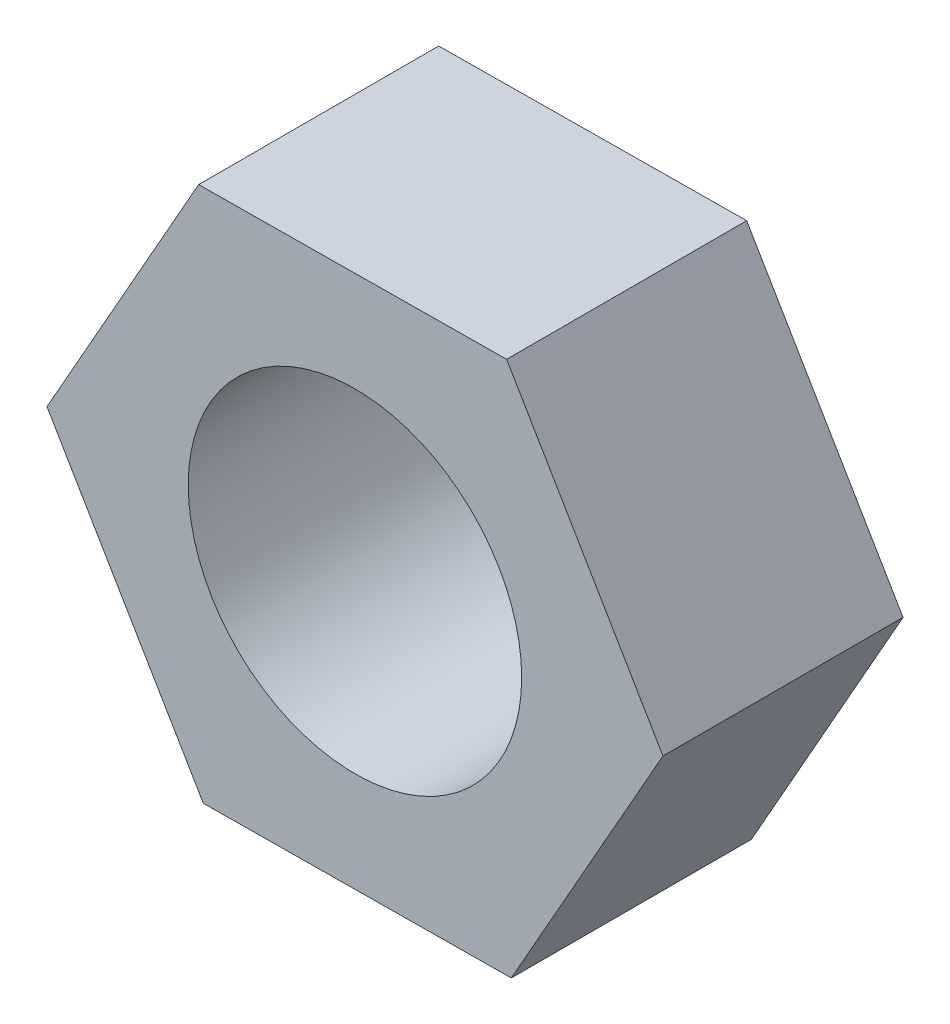
ISO-10303-21;
HEADER;
FILE_DESCRIPTION(('STEP AP214'),'2;1');
FILE_NAME('part.step','',(''),(''),'','','');
FILE_SCHEMA(('AUTOMOTIVE_DESIGN { 1 0 10303 214 1 1 1 1 }'));
ENDSEC;
DATA;
#1=APPLICATION_CONTEXT('core data for automotive mechanical design processes');
#2=APPLICATION_PROTOCOL_DEFINITION('international standard','automotive_design',2000,#1);
#3=PRODUCT_CONTEXT('',#1,'mechanical');
#4=PRODUCT('Part','Part','',(#3));
#5=PRODUCT_RELATED_PRODUCT_CATEGORY('part','',(#4));
#6=PRODUCT_DEFINITION_FORMATION('','',#4);
#7=PRODUCT_DEFINITION_CONTEXT('part definition',#1,'design');
#8=PRODUCT_DEFINITION('design','',#6,#7);
#9=PRODUCT_DEFINITION_SHAPE('','',#8);
#10=(LENGTH_UNIT() NAMED_UNIT(*) SI_UNIT(.MILLI.,.METRE.));
#11=(NAMED_UNIT(*) PLANE_ANGLE_UNIT() SI_UNIT($,.RADIAN.));
#12=(NAMED_UNIT(*) SI_UNIT($,.STERADIAN.) SOLID_ANGLE_UNIT());
#13=UNCERTAINTY_MEASURE_WITH_UNIT(LENGTH_MEASURE(1.E-05),#10,'distance_accuracy_value','');
#14=(GEOMETRIC_REPRESENTATION_CONTEXT(3) GLOBAL_UNCERTAINTY_ASSIGNED_CONTEXT((#13)) GLOBAL_UNIT_ASSIGNED_CONTEXT((#10,
#11,#12)) REPRESENTATION_CONTEXT('',''));
#15=CARTESIAN_POINT('',(0.,0.,0.));
#16=DIRECTION('',(0.,0.,1.));
#17=DIRECTION('',(1.,0.,0.));
#18=AXIS2_PLACEMENT_3D('',#15,#16,#17);
#19=CARTESIAN_POINT('',(0.,0.,3.6));
#20=DIRECTION('',(0.,0.,1.));
#21=DIRECTION('',(1.,0.,0.));
#22=AXIS2_PLACEMENT_3D('',#19,#20,#21);
#23=PLANE('',#22);
#24=DIRECTION('',(0.999961257640527,0.00880245522430782,0.));
#25=VECTOR('',#24,1.);
#26=CARTESIAN_POINT('',(-2.27410178421459,-4.02017343013524,3.6));
#27=LINE('',#26,#25);
#28=CARTESIAN_POINT('',(-2.27410178421459,-4.02017343013524,3.6));
#29=VERTEX_POINT('',#28);
#30=CARTESIAN_POINT('',(2.34452142600905,-3.97951663098897,3.6));
#31=VERTEX_POINT('',#30);
#32=EDGE_CURVE('E146',#29,#31,#27,.T.);
#33=ORIENTED_EDGE('',*,*,#32,.T.);
#34=DIRECTION('',(0.492357478980338,0.870393079529086,0.));
#35=VECTOR('',#34,1.);
#36=CARTESIAN_POINT('',(2.34452142600905,-3.97951663098897,3.6));
#37=LINE('',#36,#35);
#38=CARTESIAN_POINT('',(4.61862321022364,0.0406567991462702,3.6));
#39=VERTEX_POINT('',#38);
#40=EDGE_CURVE('E94',#31,#39,#37,.T.);
#41=ORIENTED_EDGE('',*,*,#40,.T.);
#42=DIRECTION('',(-0.507603778660189,0.861590624304778,0.));
#43=VECTOR('',#42,1.);
#44=CARTESIAN_POINT('',(4.61862321022364,0.0406567991462702,3.6));
#45=LINE('',#44,#43);
#46=CARTESIAN_POINT('',(2.27410178421459,4.02017343013524,3.6));
#47=VERTEX_POINT('',#46);
#48=EDGE_CURVE('E107',#39,#47,#45,.T.);
#49=ORIENTED_EDGE('',*,*,#48,.T.);
#50=DIRECTION('',(-0.999961257640527,-0.00880245522430783,0.));
#51=VECTOR('',#50,1.);
#52=CARTESIAN_POINT('',(2.27410178421459,4.02017343013524,3.6));
#53=LINE('',#52,#51);
#54=CARTESIAN_POINT('',(-2.34452142600905,3.97951663098897,3.6));
#55=VERTEX_POINT('',#54);
#56=EDGE_CURVE('E101',#47,#55,#53,.T.);
#57=ORIENTED_EDGE('',*,*,#56,.T.);
#58=DIRECTION('',(-0.492357478980338,-0.870393079529086,0.));
#59=VECTOR('',#58,1.);
#60=CARTESIAN_POINT('',(-2.34452142600905,3.97951663098897,3.6));
#61=LINE('',#60,#59);
#62=CARTESIAN_POINT('',(-4.61862321022364,-0.0406567991462695,3.6));
#63=VERTEX_POINT('',#62);
#64=EDGE_CURVE('E105',#55,#63,#61,.T.);
#65=ORIENTED_EDGE('',*,*,#64,.T.);
#66=DIRECTION('',(0.507603778660189,-0.861590624304779,0.));
#67=VECTOR('',#66,1.);
#68=CARTESIAN_POINT('',(-4.61862321022364,-0.0406567991462695,3.6));
#69=LINE('',#68,#67);
#70=EDGE_CURVE('E57',#63,#29,#69,.T.);
#71=ORIENTED_EDGE('',*,*,#70,.T.);
#72=EDGE_LOOP('',(#33,#41,#49,#57,#65,#71));
#73=FACE_BOUND('',#72,.T.);
#74=CARTESIAN_POINT('',(0.,0.,3.6));
#75=DIRECTION('',(0.,0.,1.));
#76=DIRECTION('',(1.,0.,0.));
#77=AXIS2_PLACEMENT_3D('',#74,#75,#76);
#78=CIRCLE('',#77,2.5);
#79=CARTESIAN_POINT('',(2.5,0.,3.6));
#80=VERTEX_POINT('',#79);
#81=EDGE_CURVE('E134',#80,#80,#78,.T.);
#82=ORIENTED_EDGE('',*,*,#81,.F.);
#83=EDGE_LOOP('',(#82));
#84=FACE_BOUND('',#83,.T.);
#85=ADVANCED_FACE('F39',(#73,#84),#23,.T.);
#86=CARTESIAN_POINT('',(0.,0.,0.));
#87=DIRECTION('',(0.,0.,1.));
#88=DIRECTION('',(1.,0.,0.));
#89=AXIS2_PLACEMENT_3D('',#86,#87,#88);
#90=PLANE('',#89);
#91=DIRECTION('',(0.999961257640527,0.00880245522430782,0.));
#92=VECTOR('',#91,1.);
#93=CARTESIAN_POINT('',(-2.27410178421459,-4.02017343013524,0.));
#94=LINE('',#93,#92);
#95=CARTESIAN_POINT('',(-2.27410178421459,-4.02017343013524,0.));
#96=VERTEX_POINT('',#95);
#97=CARTESIAN_POINT('',(2.34452142600905,-3.97951663098897,0.));
#98=VERTEX_POINT('',#97);
#99=EDGE_CURVE('E129',#96,#98,#94,.T.);
#100=ORIENTED_EDGE('',*,*,#99,.F.);
#101=DIRECTION('',(0.507603778660189,-0.861590624304779,0.));
#102=VECTOR('',#101,1.);
#103=CARTESIAN_POINT('',(-4.61862321022364,-0.0406567991462695,0.));
#104=LINE('',#103,#102);
#105=CARTESIAN_POINT('',(-4.61862321022364,-0.0406567991462695,0.));
#106=VERTEX_POINT('',#105);
#107=EDGE_CURVE('E86',#106,#96,#104,.T.);
#108=ORIENTED_EDGE('',*,*,#107,.F.);
#109=DIRECTION('',(-0.492357478980338,-0.870393079529086,0.));
#110=VECTOR('',#109,1.);
#111=CARTESIAN_POINT('',(-2.34452142600905,3.97951663098897,0.));
#112=LINE('',#111,#110);
#113=CARTESIAN_POINT('',(-2.34452142600905,3.97951663098897,0.));
#114=VERTEX_POINT('',#113);
#115=EDGE_CURVE('E80',#114,#106,#112,.T.);
#116=ORIENTED_EDGE('',*,*,#115,.F.);
#117=DIRECTION('',(-0.999961257640527,-0.00880245522430783,0.));
#118=VECTOR('',#117,1.);
#119=CARTESIAN_POINT('',(2.27410178421459,4.02017343013524,0.));
#120=LINE('',#119,#118);
#121=CARTESIAN_POINT('',(2.27410178421459,4.02017343013524,0.));
#122=VERTEX_POINT('',#121);
#123=EDGE_CURVE('E116',#122,#114,#120,.T.);
#124=ORIENTED_EDGE('',*,*,#123,.F.);
#125=DIRECTION('',(-0.507603778660189,0.861590624304778,0.));
#126=VECTOR('',#125,1.);
#127=CARTESIAN_POINT('',(4.61862321022364,0.0406567991462702,0.));
#128=LINE('',#127,#126);
#129=CARTESIAN_POINT('',(4.61862321022364,0.0406567991462702,0.));
#130=VERTEX_POINT('',#129);
#131=EDGE_CURVE('E137',#130,#122,#128,.T.);
#132=ORIENTED_EDGE('',*,*,#131,.F.);
#133=DIRECTION('',(0.492357478980338,0.870393079529086,0.));
#134=VECTOR('',#133,1.);
#135=CARTESIAN_POINT('',(2.34452142600905,-3.97951663098897,0.));
#136=LINE('',#135,#134);
#137=EDGE_CURVE('E133',#98,#130,#136,.T.);
#138=ORIENTED_EDGE('',*,*,#137,.F.);
#139=EDGE_LOOP('',(#100,#108,#116,#124,#132,#138));
#140=FACE_BOUND('',#139,.T.);
#141=CARTESIAN_POINT('',(0.,0.,0.));
#142=DIRECTION('',(0.,0.,1.));
#143=DIRECTION('',(1.,0.,0.));
#144=AXIS2_PLACEMENT_3D('',#141,#142,#143);
#145=CIRCLE('',#144,2.5);
#146=CARTESIAN_POINT('',(2.5,0.,0.));
#147=VERTEX_POINT('',#146);
#148=EDGE_CURVE('E243',#147,#147,#145,.T.);
#149=ORIENTED_EDGE('',*,*,#148,.T.);
#150=EDGE_LOOP('',(#149));
#151=FACE_BOUND('',#150,.T.);
#152=ADVANCED_FACE('F159',(#140,#151),#90,.F.);
#153=CARTESIAN_POINT('',(-2.27410178421459,-4.02017343013524,3.6));
#154=DIRECTION('',(-0.00880245522430782,0.999961257640527,0.));
#155=DIRECTION('',(-0.999961257640527,-0.00880245522430782,0.));
#156=AXIS2_PLACEMENT_3D('',#153,#154,#155);
#157=PLANE('',#156);
#158=ORIENTED_EDGE('',*,*,#99,.T.);
#159=DIRECTION('',(0.,0.,-1.));
#160=VECTOR('',#159,1.);
#161=CARTESIAN_POINT('',(2.34452142600905,-3.97951663098897,3.6));
#162=LINE('',#161,#160);
#163=EDGE_CURVE('E11',#31,#98,#162,.T.);
#164=ORIENTED_EDGE('',*,*,#163,.F.);
#165=ORIENTED_EDGE('',*,*,#32,.F.);
#166=DIRECTION('',(0.,0.,-1.));
#167=VECTOR('',#166,1.);
#168=CARTESIAN_POINT('',(-2.27410178421459,-4.02017343013524,3.6));
#169=LINE('',#168,#167);
#170=EDGE_CURVE('E125',#29,#96,#169,.T.);
#171=ORIENTED_EDGE('',*,*,#170,.T.);
#172=EDGE_LOOP('',(#158,#164,#165,#171));
#173=FACE_BOUND('',#172,.T.);
#174=ADVANCED_FACE('F41',(#173),#157,.F.);
#175=CARTESIAN_POINT('',(2.34452142600905,-3.97951663098897,3.6));
#176=DIRECTION('',(-0.870393079529086,0.492357478980338,0.));
#177=DIRECTION('',(-0.492357478980338,-0.870393079529086,0.));
#178=AXIS2_PLACEMENT_3D('',#175,#176,#177);
#179=PLANE('',#178);
#180=ORIENTED_EDGE('',*,*,#137,.T.);
#181=DIRECTION('',(0.,0.,-1.));
#182=VECTOR('',#181,1.);
#183=CARTESIAN_POINT('',(4.61862321022364,0.0406567991462702,3.6));
#184=LINE('',#183,#182);
#185=EDGE_CURVE('E49',#39,#130,#184,.T.);
#186=ORIENTED_EDGE('',*,*,#185,.F.);
#187=ORIENTED_EDGE('',*,*,#40,.F.);
#188=ORIENTED_EDGE('',*,*,#163,.T.);
#189=EDGE_LOOP('',(#180,#186,#187,#188));
#190=FACE_BOUND('',#189,.T.);
#191=ADVANCED_FACE('F184',(#190),#179,.F.);
#192=CARTESIAN_POINT('',(4.61862321022364,0.0406567991462702,3.6));
#193=DIRECTION('',(-0.861590624304778,-0.507603778660189,0.));
#194=DIRECTION('',(0.507603778660189,-0.861590624304779,0.));
#195=AXIS2_PLACEMENT_3D('',#192,#193,#194);
#196=PLANE('',#195);
#197=ORIENTED_EDGE('',*,*,#131,.T.);
#198=DIRECTION('',(0.,0.,-1.));
#199=VECTOR('',#198,1.);
#200=CARTESIAN_POINT('',(2.27410178421459,4.02017343013524,3.6));
#201=LINE('',#200,#199);
#202=EDGE_CURVE('E118',#47,#122,#201,.T.);
#203=ORIENTED_EDGE('',*,*,#202,.F.);
#204=ORIENTED_EDGE('',*,*,#48,.F.);
#205=ORIENTED_EDGE('',*,*,#185,.T.);
#206=EDGE_LOOP('',(#197,#203,#204,#205));
#207=FACE_BOUND('',#206,.T.);
#208=ADVANCED_FACE('F156',(#207),#196,.F.);
#209=CARTESIAN_POINT('',(2.27410178421459,4.02017343013524,3.6));
#210=DIRECTION('',(0.00880245522430783,-0.999961257640527,0.));
#211=DIRECTION('',(0.999961257640527,0.00880245522430783,0.));
#212=AXIS2_PLACEMENT_3D('',#209,#210,#211);
#213=PLANE('',#212);
#214=ORIENTED_EDGE('',*,*,#123,.T.);
#215=DIRECTION('',(0.,0.,-1.));
#216=VECTOR('',#215,1.);
#217=CARTESIAN_POINT('',(-2.34452142600905,3.97951663098897,3.6));
#218=LINE('',#217,#216);
#219=EDGE_CURVE('E113',#55,#114,#218,.T.);
#220=ORIENTED_EDGE('',*,*,#219,.F.);
#221=ORIENTED_EDGE('',*,*,#56,.F.);
#222=ORIENTED_EDGE('',*,*,#202,.T.);
#223=EDGE_LOOP('',(#214,#220,#221,#222));
#224=FACE_BOUND('',#223,.T.);
#225=ADVANCED_FACE('F114',(#224),#213,.F.);
#226=CARTESIAN_POINT('',(-2.34452142600905,3.97951663098897,3.6));
#227=DIRECTION('',(0.870393079529086,-0.492357478980338,0.));
#228=DIRECTION('',(0.492357478980338,0.870393079529086,0.));
#229=AXIS2_PLACEMENT_3D('',#226,#227,#228);
#230=PLANE('',#229);
#231=ORIENTED_EDGE('',*,*,#115,.T.);
#232=DIRECTION('',(0.,0.,-1.));
#233=VECTOR('',#232,1.);
#234=CARTESIAN_POINT('',(-4.61862321022364,-0.0406567991462695,3.6));
#235=LINE('',#234,#233);
#236=EDGE_CURVE('E119',#63,#106,#235,.T.);
#237=ORIENTED_EDGE('',*,*,#236,.F.);
#238=ORIENTED_EDGE('',*,*,#64,.F.);
#239=ORIENTED_EDGE('',*,*,#219,.T.);
#240=EDGE_LOOP('',(#231,#237,#238,#239));
#241=FACE_BOUND('',#240,.T.);
#242=ADVANCED_FACE('F121',(#241),#230,.F.);
#243=CARTESIAN_POINT('',(-4.61862321022364,-0.0406567991462695,3.6));
#244=DIRECTION('',(0.861590624304779,0.507603778660189,0.));
#245=DIRECTION('',(-0.507603778660189,0.861590624304779,0.));
#246=AXIS2_PLACEMENT_3D('',#243,#244,#245);
#247=PLANE('',#246);
#248=ORIENTED_EDGE('',*,*,#107,.T.);
#249=ORIENTED_EDGE('',*,*,#170,.F.);
#250=ORIENTED_EDGE('',*,*,#70,.F.);
#251=ORIENTED_EDGE('',*,*,#236,.T.);
#252=EDGE_LOOP('',(#248,#249,#250,#251));
#253=FACE_BOUND('',#252,.T.);
#254=ADVANCED_FACE('F164',(#253),#247,.F.);
#255=CARTESIAN_POINT('',(0.,0.,3.6));
#256=DIRECTION('',(0.,0.,-1.));
#257=DIRECTION('',(-1.,0.,0.));
#258=AXIS2_PLACEMENT_3D('',#255,#256,#257);
#259=CYLINDRICAL_SURFACE('',#258,2.5);
#260=ORIENTED_EDGE('',*,*,#81,.T.);
#261=EDGE_LOOP('',(#260));
#262=FACE_BOUND('',#261,.T.);
#263=ORIENTED_EDGE('',*,*,#148,.F.);
#264=EDGE_LOOP('',(#263));
#265=FACE_BOUND('',#264,.T.);
#266=ADVANCED_FACE('F166',(#262,#265),#259,.F.);
#267=CLOSED_SHELL('',(#85,#152,#174,#191,#208,#225,#242,#254,#266));
#268=MANIFOLD_SOLID_BREP('B2',#267);
#269=ADVANCED_BREP_SHAPE_REPRESENTATION('',(#18,#268),#14);
#270=SHAPE_DEFINITION_REPRESENTATION(#9,#269);
ENDSEC;
END-ISO-10303-21;
